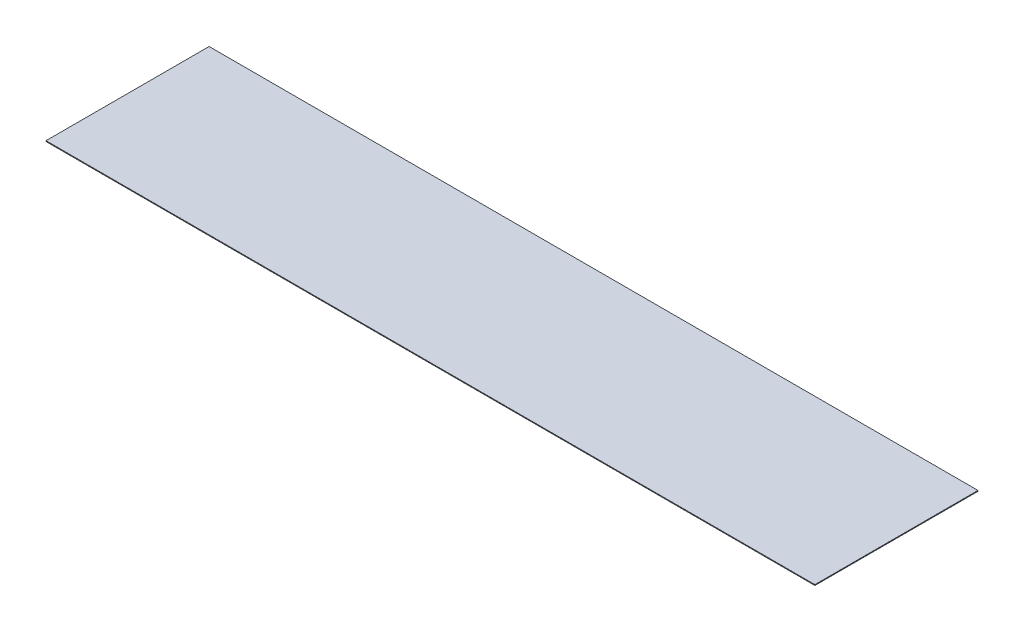
ISO-10303-21;
HEADER;
FILE_DESCRIPTION(('STEP AP214'),'2;1');
FILE_NAME('part.step','',(''),(''),'','','');
FILE_SCHEMA(('AUTOMOTIVE_DESIGN { 1 0 10303 214 1 1 1 1 }'));
ENDSEC;
DATA;
#1=APPLICATION_CONTEXT('core data for automotive mechanical design processes');
#2=APPLICATION_PROTOCOL_DEFINITION('international standard','automotive_design',2000,#1);
#3=PRODUCT_CONTEXT('',#1,'mechanical');
#4=PRODUCT('Part','Part','',(#3));
#5=PRODUCT_RELATED_PRODUCT_CATEGORY('part','',(#4));
#6=PRODUCT_DEFINITION_FORMATION('','',#4);
#7=PRODUCT_DEFINITION_CONTEXT('part definition',#1,'design');
#8=PRODUCT_DEFINITION('design','',#6,#7);
#9=PRODUCT_DEFINITION_SHAPE('','',#8);
#10=(LENGTH_UNIT() NAMED_UNIT(*) SI_UNIT(.MILLI.,.METRE.));
#11=(NAMED_UNIT(*) PLANE_ANGLE_UNIT() SI_UNIT($,.RADIAN.));
#12=(NAMED_UNIT(*) SI_UNIT($,.STERADIAN.) SOLID_ANGLE_UNIT());
#13=UNCERTAINTY_MEASURE_WITH_UNIT(LENGTH_MEASURE(1.E-05),#10,'distance_accuracy_value','');
#14=(GEOMETRIC_REPRESENTATION_CONTEXT(3) GLOBAL_UNCERTAINTY_ASSIGNED_CONTEXT((#13)) GLOBAL_UNIT_ASSIGNED_CONTEXT((#10,
#11,#12)) REPRESENTATION_CONTEXT('',''));
#15=CARTESIAN_POINT('',(0.,0.,0.));
#16=DIRECTION('',(0.,0.,1.));
#17=DIRECTION('',(1.,0.,0.));
#18=AXIS2_PLACEMENT_3D('',#15,#16,#17);
#19=CARTESIAN_POINT('',(49.5,0.1,-10.5));
#20=DIRECTION('',(-1.,0.,0.));
#21=DIRECTION('',(0.,0.,1.));
#22=AXIS2_PLACEMENT_3D('',#19,#20,#21);
#23=PLANE('',#22);
#24=DIRECTION('',(0.,0.,-1.));
#25=VECTOR('',#24,1.);
#26=CARTESIAN_POINT('',(49.5,0.,-10.5));
#27=LINE('',#26,#25);
#28=CARTESIAN_POINT('',(49.5,0.,10.5));
#29=VERTEX_POINT('',#28);
#30=CARTESIAN_POINT('',(49.5,0.,-10.5));
#31=VERTEX_POINT('',#30);
#32=EDGE_CURVE('E107',#29,#31,#27,.T.);
#33=ORIENTED_EDGE('',*,*,#32,.T.);
#34=DIRECTION('',(0.,-1.,0.));
#35=VECTOR('',#34,1.);
#36=CARTESIAN_POINT('',(49.5,0.1,-10.5));
#37=LINE('',#36,#35);
#38=CARTESIAN_POINT('',(49.5,0.1,-10.5));
#39=VERTEX_POINT('',#38);
#40=EDGE_CURVE('E11',#39,#31,#37,.T.);
#41=ORIENTED_EDGE('',*,*,#40,.F.);
#42=DIRECTION('',(0.,0.,-1.));
#43=VECTOR('',#42,1.);
#44=CARTESIAN_POINT('',(49.5,0.1,-10.5));
#45=LINE('',#44,#43);
#46=CARTESIAN_POINT('',(49.5,0.1,10.5));
#47=VERTEX_POINT('',#46);
#48=EDGE_CURVE('E91',#47,#39,#45,.T.);
#49=ORIENTED_EDGE('',*,*,#48,.F.);
#50=DIRECTION('',(0.,-1.,0.));
#51=VECTOR('',#50,1.);
#52=CARTESIAN_POINT('',(49.5,0.1,10.5));
#53=LINE('',#52,#51);
#54=EDGE_CURVE('E103',#47,#29,#53,.T.);
#55=ORIENTED_EDGE('',*,*,#54,.T.);
#56=EDGE_LOOP('',(#33,#41,#49,#55));
#57=FACE_BOUND('',#56,.T.);
#58=ADVANCED_FACE('F39',(#57),#23,.F.);
#59=CARTESIAN_POINT('',(-49.5,0.1,-10.5));
#60=DIRECTION('',(0.,0.,1.));
#61=DIRECTION('',(1.,0.,0.));
#62=AXIS2_PLACEMENT_3D('',#59,#60,#61);
#63=PLANE('',#62);
#64=DIRECTION('',(-1.,0.,0.));
#65=VECTOR('',#64,1.);
#66=CARTESIAN_POINT('',(-49.5,0.,-10.5));
#67=LINE('',#66,#65);
#68=CARTESIAN_POINT('',(-49.5,0.,-10.5));
#69=VERTEX_POINT('',#68);
#70=EDGE_CURVE('E96',#31,#69,#67,.T.);
#71=ORIENTED_EDGE('',*,*,#70,.T.);
#72=DIRECTION('',(0.,-1.,0.));
#73=VECTOR('',#72,1.);
#74=CARTESIAN_POINT('',(-49.5,0.1,-10.5));
#75=LINE('',#74,#73);
#76=CARTESIAN_POINT('',(-49.5,0.1,-10.5));
#77=VERTEX_POINT('',#76);
#78=EDGE_CURVE('E48',#77,#69,#75,.T.);
#79=ORIENTED_EDGE('',*,*,#78,.F.);
#80=DIRECTION('',(-1.,0.,0.));
#81=VECTOR('',#80,1.);
#82=CARTESIAN_POINT('',(-49.5,0.1,-10.5));
#83=LINE('',#82,#81);
#84=EDGE_CURVE('E86',#39,#77,#83,.T.);
#85=ORIENTED_EDGE('',*,*,#84,.F.);
#86=ORIENTED_EDGE('',*,*,#40,.T.);
#87=EDGE_LOOP('',(#71,#79,#85,#86));
#88=FACE_BOUND('',#87,.T.);
#89=ADVANCED_FACE('F95',(#88),#63,.F.);
#90=CARTESIAN_POINT('',(-49.5,0.1,-10.5));
#91=DIRECTION('',(1.,0.,0.));
#92=DIRECTION('',(0.,0.,-1.));
#93=AXIS2_PLACEMENT_3D('',#90,#91,#92);
#94=PLANE('',#93);
#95=DIRECTION('',(0.,0.,1.));
#96=VECTOR('',#95,1.);
#97=CARTESIAN_POINT('',(-49.5,0.,-10.5));
#98=LINE('',#97,#96);
#99=CARTESIAN_POINT('',(-49.5,0.,10.5));
#100=VERTEX_POINT('',#99);
#101=EDGE_CURVE('E73',#69,#100,#98,.T.);
#102=ORIENTED_EDGE('',*,*,#101,.T.);
#103=DIRECTION('',(0.,-1.,0.));
#104=VECTOR('',#103,1.);
#105=CARTESIAN_POINT('',(-49.5,0.1,10.5));
#106=LINE('',#105,#104);
#107=CARTESIAN_POINT('',(-49.5,0.1,10.5));
#108=VERTEX_POINT('',#107);
#109=EDGE_CURVE('E98',#108,#100,#106,.T.);
#110=ORIENTED_EDGE('',*,*,#109,.F.);
#111=DIRECTION('',(0.,0.,1.));
#112=VECTOR('',#111,1.);
#113=CARTESIAN_POINT('',(-49.5,0.1,-10.5));
#114=LINE('',#113,#112);
#115=EDGE_CURVE('E89',#77,#108,#114,.T.);
#116=ORIENTED_EDGE('',*,*,#115,.F.);
#117=ORIENTED_EDGE('',*,*,#78,.T.);
#118=EDGE_LOOP('',(#102,#110,#116,#117));
#119=FACE_BOUND('',#118,.T.);
#120=ADVANCED_FACE('F99',(#119),#94,.F.);
#121=CARTESIAN_POINT('',(-49.5,0.1,10.5));
#122=DIRECTION('',(0.,0.,-1.));
#123=DIRECTION('',(-1.,0.,0.));
#124=AXIS2_PLACEMENT_3D('',#121,#122,#123);
#125=PLANE('',#124);
#126=DIRECTION('',(1.,0.,0.));
#127=VECTOR('',#126,1.);
#128=CARTESIAN_POINT('',(-49.5,0.,10.5));
#129=LINE('',#128,#127);
#130=EDGE_CURVE('E79',#100,#29,#129,.T.);
#131=ORIENTED_EDGE('',*,*,#130,.T.);
#132=ORIENTED_EDGE('',*,*,#54,.F.);
#133=DIRECTION('',(1.,0.,0.));
#134=VECTOR('',#133,1.);
#135=CARTESIAN_POINT('',(-49.5,0.1,10.5));
#136=LINE('',#135,#134);
#137=EDGE_CURVE('E56',#108,#47,#136,.T.);
#138=ORIENTED_EDGE('',*,*,#137,.F.);
#139=ORIENTED_EDGE('',*,*,#109,.T.);
#140=EDGE_LOOP('',(#131,#132,#138,#139));
#141=FACE_BOUND('',#140,.T.);
#142=ADVANCED_FACE('F120',(#141),#125,.F.);
#143=CARTESIAN_POINT('',(0.,0.1,0.));
#144=DIRECTION('',(0.,1.,0.));
#145=DIRECTION('',(0.,0.,1.));
#146=AXIS2_PLACEMENT_3D('',#143,#144,#145);
#147=PLANE('',#146);
#148=ORIENTED_EDGE('',*,*,#48,.T.);
#149=ORIENTED_EDGE('',*,*,#84,.T.);
#150=ORIENTED_EDGE('',*,*,#115,.T.);
#151=ORIENTED_EDGE('',*,*,#137,.T.);
#152=EDGE_LOOP('',(#148,#149,#150,#151));
#153=FACE_BOUND('',#152,.T.);
#154=ADVANCED_FACE('F87',(#153),#147,.T.);
#155=CARTESIAN_POINT('',(0.,0.,0.));
#156=DIRECTION('',(0.,1.,0.));
#157=DIRECTION('',(0.,0.,1.));
#158=AXIS2_PLACEMENT_3D('',#155,#156,#157);
#159=PLANE('',#158);
#160=ORIENTED_EDGE('',*,*,#32,.F.);
#161=ORIENTED_EDGE('',*,*,#130,.F.);
#162=ORIENTED_EDGE('',*,*,#101,.F.);
#163=ORIENTED_EDGE('',*,*,#70,.F.);
#164=EDGE_LOOP('',(#160,#161,#162,#163));
#165=FACE_BOUND('',#164,.T.);
#166=ADVANCED_FACE('F123',(#165),#159,.F.);
#167=CLOSED_SHELL('',(#58,#89,#120,#142,#154,#166));
#168=MANIFOLD_SOLID_BREP('B2',#167);
#169=ADVANCED_BREP_SHAPE_REPRESENTATION('',(#18,#168),#14);
#170=SHAPE_DEFINITION_REPRESENTATION(#9,#169);
ENDSEC;
END-ISO-10303-21;
